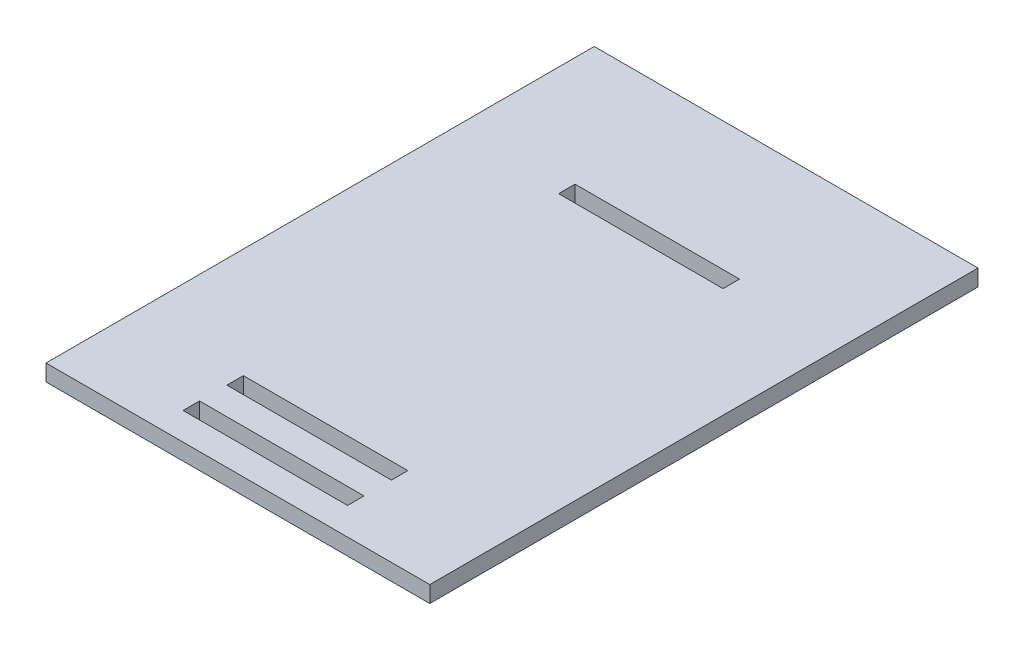
ISO-10303-21;
HEADER;
FILE_DESCRIPTION(('STEP AP214'),'2;1');
FILE_NAME('part.step','',(''),(''),'','','');
FILE_SCHEMA(('AUTOMOTIVE_DESIGN { 1 0 10303 214 1 1 1 1 }'));
ENDSEC;
DATA;
#1=APPLICATION_CONTEXT('core data for automotive mechanical design processes');
#2=APPLICATION_PROTOCOL_DEFINITION('international standard','automotive_design',2000,#1);
#3=PRODUCT_CONTEXT('',#1,'mechanical');
#4=PRODUCT('Part','Part','',(#3));
#5=PRODUCT_RELATED_PRODUCT_CATEGORY('part','',(#4));
#6=PRODUCT_DEFINITION_FORMATION('','',#4);
#7=PRODUCT_DEFINITION_CONTEXT('part definition',#1,'design');
#8=PRODUCT_DEFINITION('design','',#6,#7);
#9=PRODUCT_DEFINITION_SHAPE('','',#8);
#10=(LENGTH_UNIT() NAMED_UNIT(*) SI_UNIT(.MILLI.,.METRE.));
#11=(NAMED_UNIT(*) PLANE_ANGLE_UNIT() SI_UNIT($,.RADIAN.));
#12=(NAMED_UNIT(*) SI_UNIT($,.STERADIAN.) SOLID_ANGLE_UNIT());
#13=UNCERTAINTY_MEASURE_WITH_UNIT(LENGTH_MEASURE(1.E-05),#10,'distance_accuracy_value','');
#14=(GEOMETRIC_REPRESENTATION_CONTEXT(3) GLOBAL_UNCERTAINTY_ASSIGNED_CONTEXT((#13)) GLOBAL_UNIT_ASSIGNED_CONTEXT((#10,
#11,#12)) REPRESENTATION_CONTEXT('',''));
#15=CARTESIAN_POINT('',(0.,0.,0.));
#16=DIRECTION('',(0.,0.,1.));
#17=DIRECTION('',(1.,0.,0.));
#18=AXIS2_PLACEMENT_3D('',#15,#16,#17);
#19=CARTESIAN_POINT('',(-35.,3.,-50.));
#20=DIRECTION('',(1.,0.,0.));
#21=DIRECTION('',(0.,0.,-1.));
#22=AXIS2_PLACEMENT_3D('',#19,#20,#21);
#23=PLANE('',#22);
#24=DIRECTION('',(0.,0.,1.));
#25=VECTOR('',#24,1.);
#26=CARTESIAN_POINT('',(-35.,0.,-50.));
#27=LINE('',#26,#25);
#28=CARTESIAN_POINT('',(-35.,0.,-50.));
#29=VERTEX_POINT('',#28);
#30=CARTESIAN_POINT('',(-35.,0.,50.));
#31=VERTEX_POINT('',#30);
#32=EDGE_CURVE('E188',#29,#31,#27,.T.);
#33=ORIENTED_EDGE('',*,*,#32,.T.);
#34=DIRECTION('',(0.,-1.,0.));
#35=VECTOR('',#34,1.);
#36=CARTESIAN_POINT('',(-35.,3.,50.));
#37=LINE('',#36,#35);
#38=CARTESIAN_POINT('',(-35.,3.,50.));
#39=VERTEX_POINT('',#38);
#40=EDGE_CURVE('E11',#39,#31,#37,.T.);
#41=ORIENTED_EDGE('',*,*,#40,.F.);
#42=DIRECTION('',(0.,0.,1.));
#43=VECTOR('',#42,1.);
#44=CARTESIAN_POINT('',(-35.,3.,-50.));
#45=LINE('',#44,#43);
#46=CARTESIAN_POINT('',(-35.,3.,-50.));
#47=VERTEX_POINT('',#46);
#48=EDGE_CURVE('E254',#47,#39,#45,.T.);
#49=ORIENTED_EDGE('',*,*,#48,.F.);
#50=DIRECTION('',(0.,-1.,0.));
#51=VECTOR('',#50,1.);
#52=CARTESIAN_POINT('',(-35.,3.,-50.));
#53=LINE('',#52,#51);
#54=EDGE_CURVE('E264',#47,#29,#53,.T.);
#55=ORIENTED_EDGE('',*,*,#54,.T.);
#56=EDGE_LOOP('',(#33,#41,#49,#55));
#57=FACE_BOUND('',#56,.T.);
#58=ADVANCED_FACE('F40',(#57),#23,.F.);
#59=CARTESIAN_POINT('',(35.,3.,50.));
#60=DIRECTION('',(0.,0.,-1.));
#61=DIRECTION('',(-1.,0.,0.));
#62=AXIS2_PLACEMENT_3D('',#59,#60,#61);
#63=PLANE('',#62);
#64=DIRECTION('',(1.,0.,0.));
#65=VECTOR('',#64,1.);
#66=CARTESIAN_POINT('',(35.,0.,50.));
#67=LINE('',#66,#65);
#68=CARTESIAN_POINT('',(35.,0.,50.));
#69=VERTEX_POINT('',#68);
#70=EDGE_CURVE('E267',#31,#69,#67,.T.);
#71=ORIENTED_EDGE('',*,*,#70,.T.);
#72=DIRECTION('',(0.,-1.,0.));
#73=VECTOR('',#72,1.);
#74=CARTESIAN_POINT('',(35.,3.,50.));
#75=LINE('',#74,#73);
#76=CARTESIAN_POINT('',(35.,3.,50.));
#77=VERTEX_POINT('',#76);
#78=EDGE_CURVE('E47',#77,#69,#75,.T.);
#79=ORIENTED_EDGE('',*,*,#78,.F.);
#80=DIRECTION('',(1.,0.,0.));
#81=VECTOR('',#80,1.);
#82=CARTESIAN_POINT('',(35.,3.,50.));
#83=LINE('',#82,#81);
#84=EDGE_CURVE('E257',#39,#77,#83,.T.);
#85=ORIENTED_EDGE('',*,*,#84,.F.);
#86=ORIENTED_EDGE('',*,*,#40,.T.);
#87=EDGE_LOOP('',(#71,#79,#85,#86));
#88=FACE_BOUND('',#87,.T.);
#89=ADVANCED_FACE('F296',(#88),#63,.F.);
#90=CARTESIAN_POINT('',(35.,3.,-50.));
#91=DIRECTION('',(-1.,0.,0.));
#92=DIRECTION('',(0.,0.,1.));
#93=AXIS2_PLACEMENT_3D('',#90,#91,#92);
#94=PLANE('',#93);
#95=DIRECTION('',(0.,0.,-1.));
#96=VECTOR('',#95,1.);
#97=CARTESIAN_POINT('',(35.,0.,-50.));
#98=LINE('',#97,#96);
#99=CARTESIAN_POINT('',(35.,0.,-50.));
#100=VERTEX_POINT('',#99);
#101=EDGE_CURVE('E269',#69,#100,#98,.T.);
#102=ORIENTED_EDGE('',*,*,#101,.T.);
#103=DIRECTION('',(0.,-1.,0.));
#104=VECTOR('',#103,1.);
#105=CARTESIAN_POINT('',(35.,3.,-50.));
#106=LINE('',#105,#104);
#107=CARTESIAN_POINT('',(35.,3.,-50.));
#108=VERTEX_POINT('',#107);
#109=EDGE_CURVE('E274',#108,#100,#106,.T.);
#110=ORIENTED_EDGE('',*,*,#109,.F.);
#111=DIRECTION('',(0.,0.,-1.));
#112=VECTOR('',#111,1.);
#113=CARTESIAN_POINT('',(35.,3.,-50.));
#114=LINE('',#113,#112);
#115=EDGE_CURVE('E260',#77,#108,#114,.T.);
#116=ORIENTED_EDGE('',*,*,#115,.F.);
#117=ORIENTED_EDGE('',*,*,#78,.T.);
#118=EDGE_LOOP('',(#102,#110,#116,#117));
#119=FACE_BOUND('',#118,.T.);
#120=ADVANCED_FACE('F281',(#119),#94,.F.);
#121=CARTESIAN_POINT('',(35.,3.,-50.));
#122=DIRECTION('',(0.,0.,1.));
#123=DIRECTION('',(1.,0.,0.));
#124=AXIS2_PLACEMENT_3D('',#121,#122,#123);
#125=PLANE('',#124);
#126=DIRECTION('',(-1.,0.,0.));
#127=VECTOR('',#126,1.);
#128=CARTESIAN_POINT('',(35.,0.,-50.));
#129=LINE('',#128,#127);
#130=EDGE_CURVE('E258',#100,#29,#129,.T.);
#131=ORIENTED_EDGE('',*,*,#130,.T.);
#132=ORIENTED_EDGE('',*,*,#54,.F.);
#133=DIRECTION('',(-1.,0.,0.));
#134=VECTOR('',#133,1.);
#135=CARTESIAN_POINT('',(35.,3.,-50.));
#136=LINE('',#135,#134);
#137=EDGE_CURVE('E262',#108,#47,#136,.T.);
#138=ORIENTED_EDGE('',*,*,#137,.F.);
#139=ORIENTED_EDGE('',*,*,#109,.T.);
#140=EDGE_LOOP('',(#131,#132,#138,#139));
#141=FACE_BOUND('',#140,.T.);
#142=ADVANCED_FACE('F289',(#141),#125,.F.);
#143=CARTESIAN_POINT('',(0.,3.,0.));
#144=DIRECTION('',(0.,-1.,0.));
#145=DIRECTION('',(0.,0.,-1.));
#146=AXIS2_PLACEMENT_3D('',#143,#144,#145);
#147=PLANE('',#146);
#148=DIRECTION('',(1.,0.,0.));
#149=VECTOR('',#148,1.);
#150=CARTESIAN_POINT('',(15.0000000000002,3.,45.));
#151=LINE('',#150,#149);
#152=CARTESIAN_POINT('',(-14.9999999999998,3.,45.));
#153=VERTEX_POINT('',#152);
#154=CARTESIAN_POINT('',(15.0000000000002,3.,45.));
#155=VERTEX_POINT('',#154);
#156=EDGE_CURVE('E182',#153,#155,#151,.T.);
#157=ORIENTED_EDGE('',*,*,#156,.F.);
#158=DIRECTION('',(0.,0.,1.));
#159=VECTOR('',#158,1.);
#160=CARTESIAN_POINT('',(-14.9999999999998,3.,42.));
#161=LINE('',#160,#159);
#162=CARTESIAN_POINT('',(-14.9999999999998,3.,42.));
#163=VERTEX_POINT('',#162);
#164=EDGE_CURVE('E54',#163,#153,#161,.T.);
#165=ORIENTED_EDGE('',*,*,#164,.F.);
#166=DIRECTION('',(-1.,0.,0.));
#167=VECTOR('',#166,1.);
#168=CARTESIAN_POINT('',(15.0000000000002,3.,42.));
#169=LINE('',#168,#167);
#170=CARTESIAN_POINT('',(15.0000000000002,3.,42.));
#171=VERTEX_POINT('',#170);
#172=EDGE_CURVE('E173',#171,#163,#169,.T.);
#173=ORIENTED_EDGE('',*,*,#172,.F.);
#174=DIRECTION('',(0.,0.,-1.));
#175=VECTOR('',#174,1.);
#176=CARTESIAN_POINT('',(15.0000000000002,3.,42.));
#177=LINE('',#176,#175);
#178=EDGE_CURVE('E176',#155,#171,#177,.T.);
#179=ORIENTED_EDGE('',*,*,#178,.F.);
#180=EDGE_LOOP('',(#157,#165,#173,#179));
#181=FACE_BOUND('',#180,.T.);
#182=DIRECTION('',(1.,0.,0.));
#183=VECTOR('',#182,1.);
#184=CARTESIAN_POINT('',(15.0000000000001,3.,37.));
#185=LINE('',#184,#183);
#186=CARTESIAN_POINT('',(-14.9999999999999,3.,37.));
#187=VERTEX_POINT('',#186);
#188=CARTESIAN_POINT('',(15.0000000000001,3.,37.));
#189=VERTEX_POINT('',#188);
#190=EDGE_CURVE('E209',#187,#189,#185,.T.);
#191=ORIENTED_EDGE('',*,*,#190,.F.);
#192=DIRECTION('',(0.,0.,1.));
#193=VECTOR('',#192,1.);
#194=CARTESIAN_POINT('',(-14.9999999999999,3.,34.));
#195=LINE('',#194,#193);
#196=CARTESIAN_POINT('',(-14.9999999999999,3.,34.));
#197=VERTEX_POINT('',#196);
#198=EDGE_CURVE('E62',#197,#187,#195,.T.);
#199=ORIENTED_EDGE('',*,*,#198,.F.);
#200=DIRECTION('',(-1.,0.,0.));
#201=VECTOR('',#200,1.);
#202=CARTESIAN_POINT('',(15.0000000000001,3.,34.));
#203=LINE('',#202,#201);
#204=CARTESIAN_POINT('',(15.0000000000001,3.,34.));
#205=VERTEX_POINT('',#204);
#206=EDGE_CURVE('E202',#205,#197,#203,.T.);
#207=ORIENTED_EDGE('',*,*,#206,.F.);
#208=DIRECTION('',(0.,0.,-1.));
#209=VECTOR('',#208,1.);
#210=CARTESIAN_POINT('',(15.0000000000001,3.,34.));
#211=LINE('',#210,#209);
#212=EDGE_CURVE('E205',#189,#205,#211,.T.);
#213=ORIENTED_EDGE('',*,*,#212,.F.);
#214=EDGE_LOOP('',(#191,#199,#207,#213));
#215=FACE_BOUND('',#214,.T.);
#216=DIRECTION('',(1.,0.,0.));
#217=VECTOR('',#216,1.);
#218=CARTESIAN_POINT('',(15.0000000000001,3.,-23.5));
#219=LINE('',#218,#217);
#220=CARTESIAN_POINT('',(-14.9999999999999,3.,-23.5));
#221=VERTEX_POINT('',#220);
#222=CARTESIAN_POINT('',(15.0000000000001,3.,-23.5));
#223=VERTEX_POINT('',#222);
#224=EDGE_CURVE('E240',#221,#223,#219,.T.);
#225=ORIENTED_EDGE('',*,*,#224,.F.);
#226=DIRECTION('',(0.,0.,1.));
#227=VECTOR('',#226,1.);
#228=CARTESIAN_POINT('',(-14.9999999999999,3.,-23.5));
#229=LINE('',#228,#227);
#230=CARTESIAN_POINT('',(-14.9999999999999,3.,-26.5));
#231=VERTEX_POINT('',#230);
#232=EDGE_CURVE('E201',#231,#221,#229,.T.);
#233=ORIENTED_EDGE('',*,*,#232,.F.);
#234=DIRECTION('',(-1.,0.,0.));
#235=VECTOR('',#234,1.);
#236=CARTESIAN_POINT('',(15.0000000000001,3.,-26.5));
#237=LINE('',#236,#235);
#238=CARTESIAN_POINT('',(15.0000000000001,3.,-26.5));
#239=VERTEX_POINT('',#238);
#240=EDGE_CURVE('E233',#239,#231,#237,.T.);
#241=ORIENTED_EDGE('',*,*,#240,.F.);
#242=DIRECTION('',(0.,0.,-1.));
#243=VECTOR('',#242,1.);
#244=CARTESIAN_POINT('',(15.0000000000001,3.,-23.5));
#245=LINE('',#244,#243);
#246=EDGE_CURVE('E236',#223,#239,#245,.T.);
#247=ORIENTED_EDGE('',*,*,#246,.F.);
#248=EDGE_LOOP('',(#225,#233,#241,#247));
#249=FACE_BOUND('',#248,.T.);
#250=ORIENTED_EDGE('',*,*,#48,.T.);
#251=ORIENTED_EDGE('',*,*,#84,.T.);
#252=ORIENTED_EDGE('',*,*,#115,.T.);
#253=ORIENTED_EDGE('',*,*,#137,.T.);
#254=EDGE_LOOP('',(#250,#251,#252,#253));
#255=FACE_BOUND('',#254,.T.);
#256=ADVANCED_FACE('F295',(#181,#215,#249,#255),#147,.F.);
#257=CARTESIAN_POINT('',(0.,0.,0.));
#258=DIRECTION('',(0.,-1.,0.));
#259=DIRECTION('',(0.,0.,-1.));
#260=AXIS2_PLACEMENT_3D('',#257,#258,#259);
#261=PLANE('',#260);
#262=DIRECTION('',(0.,0.,1.));
#263=VECTOR('',#262,1.);
#264=CARTESIAN_POINT('',(-14.9999999999998,0.,42.));
#265=LINE('',#264,#263);
#266=CARTESIAN_POINT('',(-14.9999999999998,0.,42.));
#267=VERTEX_POINT('',#266);
#268=CARTESIAN_POINT('',(-14.9999999999998,0.,45.));
#269=VERTEX_POINT('',#268);
#270=EDGE_CURVE('E154',#267,#269,#265,.T.);
#271=ORIENTED_EDGE('',*,*,#270,.T.);
#272=DIRECTION('',(1.,0.,0.));
#273=VECTOR('',#272,1.);
#274=CARTESIAN_POINT('',(15.0000000000002,0.,45.));
#275=LINE('',#274,#273);
#276=CARTESIAN_POINT('',(15.0000000000002,0.,45.));
#277=VERTEX_POINT('',#276);
#278=EDGE_CURVE('E164',#269,#277,#275,.T.);
#279=ORIENTED_EDGE('',*,*,#278,.T.);
#280=DIRECTION('',(0.,0.,-1.));
#281=VECTOR('',#280,1.);
#282=CARTESIAN_POINT('',(15.0000000000002,0.,42.));
#283=LINE('',#282,#281);
#284=CARTESIAN_POINT('',(15.0000000000002,0.,42.));
#285=VERTEX_POINT('',#284);
#286=EDGE_CURVE('E168',#277,#285,#283,.T.);
#287=ORIENTED_EDGE('',*,*,#286,.T.);
#288=DIRECTION('',(-1.,0.,0.));
#289=VECTOR('',#288,1.);
#290=CARTESIAN_POINT('',(15.0000000000002,0.,42.));
#291=LINE('',#290,#289);
#292=EDGE_CURVE('E160',#285,#267,#291,.T.);
#293=ORIENTED_EDGE('',*,*,#292,.T.);
#294=EDGE_LOOP('',(#271,#279,#287,#293));
#295=FACE_BOUND('',#294,.T.);
#296=DIRECTION('',(0.,0.,1.));
#297=VECTOR('',#296,1.);
#298=CARTESIAN_POINT('',(-14.9999999999999,0.,34.));
#299=LINE('',#298,#297);
#300=CARTESIAN_POINT('',(-14.9999999999999,0.,34.));
#301=VERTEX_POINT('',#300);
#302=CARTESIAN_POINT('',(-14.9999999999999,0.,37.));
#303=VERTEX_POINT('',#302);
#304=EDGE_CURVE('E206',#301,#303,#299,.T.);
#305=ORIENTED_EDGE('',*,*,#304,.T.);
#306=DIRECTION('',(1.,0.,0.));
#307=VECTOR('',#306,1.);
#308=CARTESIAN_POINT('',(15.0000000000001,0.,37.));
#309=LINE('',#308,#307);
#310=CARTESIAN_POINT('',(15.0000000000001,0.,37.));
#311=VERTEX_POINT('',#310);
#312=EDGE_CURVE('E218',#303,#311,#309,.T.);
#313=ORIENTED_EDGE('',*,*,#312,.T.);
#314=DIRECTION('',(0.,0.,-1.));
#315=VECTOR('',#314,1.);
#316=CARTESIAN_POINT('',(15.0000000000001,0.,34.));
#317=LINE('',#316,#315);
#318=CARTESIAN_POINT('',(15.0000000000001,0.,34.));
#319=VERTEX_POINT('',#318);
#320=EDGE_CURVE('E215',#311,#319,#317,.T.);
#321=ORIENTED_EDGE('',*,*,#320,.T.);
#322=DIRECTION('',(-1.,0.,0.));
#323=VECTOR('',#322,1.);
#324=CARTESIAN_POINT('',(15.0000000000001,0.,34.));
#325=LINE('',#324,#323);
#326=EDGE_CURVE('E194',#319,#301,#325,.T.);
#327=ORIENTED_EDGE('',*,*,#326,.T.);
#328=EDGE_LOOP('',(#305,#313,#321,#327));
#329=FACE_BOUND('',#328,.T.);
#330=DIRECTION('',(0.,0.,1.));
#331=VECTOR('',#330,1.);
#332=CARTESIAN_POINT('',(-14.9999999999999,0.,-23.5));
#333=LINE('',#332,#331);
#334=CARTESIAN_POINT('',(-14.9999999999999,0.,-26.5));
#335=VERTEX_POINT('',#334);
#336=CARTESIAN_POINT('',(-14.9999999999999,0.,-23.5));
#337=VERTEX_POINT('',#336);
#338=EDGE_CURVE('E237',#335,#337,#333,.T.);
#339=ORIENTED_EDGE('',*,*,#338,.T.);
#340=DIRECTION('',(1.,0.,0.));
#341=VECTOR('',#340,1.);
#342=CARTESIAN_POINT('',(15.0000000000001,0.,-23.5));
#343=LINE('',#342,#341);
#344=CARTESIAN_POINT('',(15.0000000000001,0.,-23.5));
#345=VERTEX_POINT('',#344);
#346=EDGE_CURVE('E249',#337,#345,#343,.T.);
#347=ORIENTED_EDGE('',*,*,#346,.T.);
#348=DIRECTION('',(0.,0.,-1.));
#349=VECTOR('',#348,1.);
#350=CARTESIAN_POINT('',(15.0000000000001,0.,-23.5));
#351=LINE('',#350,#349);
#352=CARTESIAN_POINT('',(15.0000000000001,0.,-26.5));
#353=VERTEX_POINT('',#352);
#354=EDGE_CURVE('E246',#345,#353,#351,.T.);
#355=ORIENTED_EDGE('',*,*,#354,.T.);
#356=DIRECTION('',(-1.,0.,0.));
#357=VECTOR('',#356,1.);
#358=CARTESIAN_POINT('',(15.0000000000001,0.,-26.5));
#359=LINE('',#358,#357);
#360=EDGE_CURVE('E226',#353,#335,#359,.T.);
#361=ORIENTED_EDGE('',*,*,#360,.T.);
#362=EDGE_LOOP('',(#339,#347,#355,#361));
#363=FACE_BOUND('',#362,.T.);
#364=ORIENTED_EDGE('',*,*,#32,.F.);
#365=ORIENTED_EDGE('',*,*,#130,.F.);
#366=ORIENTED_EDGE('',*,*,#101,.F.);
#367=ORIENTED_EDGE('',*,*,#70,.F.);
#368=EDGE_LOOP('',(#364,#365,#366,#367));
#369=FACE_BOUND('',#368,.T.);
#370=ADVANCED_FACE('F170',(#295,#329,#363,#369),#261,.T.);
#371=CARTESIAN_POINT('',(-14.9999999999999,0.,-23.5));
#372=DIRECTION('',(-1.,0.,0.));
#373=DIRECTION('',(0.,0.,1.));
#374=AXIS2_PLACEMENT_3D('',#371,#372,#373);
#375=PLANE('',#374);
#376=ORIENTED_EDGE('',*,*,#232,.T.);
#377=DIRECTION('',(0.,1.,0.));
#378=VECTOR('',#377,1.);
#379=CARTESIAN_POINT('',(-14.9999999999999,0.,-23.5));
#380=LINE('',#379,#378);
#381=EDGE_CURVE('E223',#337,#221,#380,.T.);
#382=ORIENTED_EDGE('',*,*,#381,.F.);
#383=ORIENTED_EDGE('',*,*,#338,.F.);
#384=DIRECTION('',(0.,1.,0.));
#385=VECTOR('',#384,1.);
#386=CARTESIAN_POINT('',(-14.9999999999999,0.,-26.5));
#387=LINE('',#386,#385);
#388=EDGE_CURVE('E231',#335,#231,#387,.T.);
#389=ORIENTED_EDGE('',*,*,#388,.T.);
#390=EDGE_LOOP('',(#376,#382,#383,#389));
#391=FACE_BOUND('',#390,.T.);
#392=ADVANCED_FACE('F308',(#391),#375,.F.);
#393=CARTESIAN_POINT('',(15.0000000000001,0.,-26.5));
#394=DIRECTION('',(0.,0.,-1.));
#395=DIRECTION('',(-1.,0.,0.));
#396=AXIS2_PLACEMENT_3D('',#393,#394,#395);
#397=PLANE('',#396);
#398=ORIENTED_EDGE('',*,*,#240,.T.);
#399=ORIENTED_EDGE('',*,*,#388,.F.);
#400=ORIENTED_EDGE('',*,*,#360,.F.);
#401=DIRECTION('',(0.,1.,0.));
#402=VECTOR('',#401,1.);
#403=CARTESIAN_POINT('',(15.0000000000001,0.,-26.5));
#404=LINE('',#403,#402);
#405=EDGE_CURVE('E229',#353,#239,#404,.T.);
#406=ORIENTED_EDGE('',*,*,#405,.T.);
#407=EDGE_LOOP('',(#398,#399,#400,#406));
#408=FACE_BOUND('',#407,.T.);
#409=ADVANCED_FACE('F312',(#408),#397,.F.);
#410=CARTESIAN_POINT('',(15.0000000000001,0.,-23.5));
#411=DIRECTION('',(1.,0.,0.));
#412=DIRECTION('',(0.,0.,-1.));
#413=AXIS2_PLACEMENT_3D('',#410,#411,#412);
#414=PLANE('',#413);
#415=ORIENTED_EDGE('',*,*,#246,.T.);
#416=ORIENTED_EDGE('',*,*,#405,.F.);
#417=ORIENTED_EDGE('',*,*,#354,.F.);
#418=DIRECTION('',(0.,1.,0.));
#419=VECTOR('',#418,1.);
#420=CARTESIAN_POINT('',(15.0000000000001,0.,-23.5));
#421=LINE('',#420,#419);
#422=EDGE_CURVE('E227',#345,#223,#421,.T.);
#423=ORIENTED_EDGE('',*,*,#422,.T.);
#424=EDGE_LOOP('',(#415,#416,#417,#423));
#425=FACE_BOUND('',#424,.T.);
#426=ADVANCED_FACE('F315',(#425),#414,.F.);
#427=CARTESIAN_POINT('',(15.0000000000001,0.,-23.5));
#428=DIRECTION('',(0.,0.,1.));
#429=DIRECTION('',(1.,0.,0.));
#430=AXIS2_PLACEMENT_3D('',#427,#428,#429);
#431=PLANE('',#430);
#432=ORIENTED_EDGE('',*,*,#224,.T.);
#433=ORIENTED_EDGE('',*,*,#422,.F.);
#434=ORIENTED_EDGE('',*,*,#346,.F.);
#435=ORIENTED_EDGE('',*,*,#381,.T.);
#436=EDGE_LOOP('',(#432,#433,#434,#435));
#437=FACE_BOUND('',#436,.T.);
#438=ADVANCED_FACE('F319',(#437),#431,.F.);
#439=CARTESIAN_POINT('',(-14.9999999999999,0.,34.));
#440=DIRECTION('',(-1.,0.,0.));
#441=DIRECTION('',(0.,0.,1.));
#442=AXIS2_PLACEMENT_3D('',#439,#440,#441);
#443=PLANE('',#442);
#444=ORIENTED_EDGE('',*,*,#198,.T.);
#445=DIRECTION('',(0.,1.,0.));
#446=VECTOR('',#445,1.);
#447=CARTESIAN_POINT('',(-14.9999999999999,0.,37.));
#448=LINE('',#447,#446);
#449=EDGE_CURVE('E192',#303,#187,#448,.T.);
#450=ORIENTED_EDGE('',*,*,#449,.F.);
#451=ORIENTED_EDGE('',*,*,#304,.F.);
#452=DIRECTION('',(0.,1.,0.));
#453=VECTOR('',#452,1.);
#454=CARTESIAN_POINT('',(-14.9999999999999,0.,34.));
#455=LINE('',#454,#453);
#456=EDGE_CURVE('E199',#301,#197,#455,.T.);
#457=ORIENTED_EDGE('',*,*,#456,.T.);
#458=EDGE_LOOP('',(#444,#450,#451,#457));
#459=FACE_BOUND('',#458,.T.);
#460=ADVANCED_FACE('F323',(#459),#443,.F.);
#461=CARTESIAN_POINT('',(15.0000000000001,0.,34.));
#462=DIRECTION('',(0.,0.,-1.));
#463=DIRECTION('',(-1.,0.,0.));
#464=AXIS2_PLACEMENT_3D('',#461,#462,#463);
#465=PLANE('',#464);
#466=ORIENTED_EDGE('',*,*,#206,.T.);
#467=ORIENTED_EDGE('',*,*,#456,.F.);
#468=ORIENTED_EDGE('',*,*,#326,.F.);
#469=DIRECTION('',(0.,1.,0.));
#470=VECTOR('',#469,1.);
#471=CARTESIAN_POINT('',(15.0000000000001,0.,34.));
#472=LINE('',#471,#470);
#473=EDGE_CURVE('E197',#319,#205,#472,.T.);
#474=ORIENTED_EDGE('',*,*,#473,.T.);
#475=EDGE_LOOP('',(#466,#467,#468,#474));
#476=FACE_BOUND('',#475,.T.);
#477=ADVANCED_FACE('F328',(#476),#465,.F.);
#478=CARTESIAN_POINT('',(15.0000000000001,0.,34.));
#479=DIRECTION('',(1.,0.,0.));
#480=DIRECTION('',(0.,0.,-1.));
#481=AXIS2_PLACEMENT_3D('',#478,#479,#480);
#482=PLANE('',#481);
#483=ORIENTED_EDGE('',*,*,#212,.T.);
#484=ORIENTED_EDGE('',*,*,#473,.F.);
#485=ORIENTED_EDGE('',*,*,#320,.F.);
#486=DIRECTION('',(0.,1.,0.));
#487=VECTOR('',#486,1.);
#488=CARTESIAN_POINT('',(15.0000000000001,0.,37.));
#489=LINE('',#488,#487);
#490=EDGE_CURVE('E195',#311,#189,#489,.T.);
#491=ORIENTED_EDGE('',*,*,#490,.T.);
#492=EDGE_LOOP('',(#483,#484,#485,#491));
#493=FACE_BOUND('',#492,.T.);
#494=ADVANCED_FACE('F331',(#493),#482,.F.);
#495=CARTESIAN_POINT('',(15.0000000000001,0.,37.));
#496=DIRECTION('',(0.,0.,1.));
#497=DIRECTION('',(1.,0.,0.));
#498=AXIS2_PLACEMENT_3D('',#495,#496,#497);
#499=PLANE('',#498);
#500=ORIENTED_EDGE('',*,*,#190,.T.);
#501=ORIENTED_EDGE('',*,*,#490,.F.);
#502=ORIENTED_EDGE('',*,*,#312,.F.);
#503=ORIENTED_EDGE('',*,*,#449,.T.);
#504=EDGE_LOOP('',(#500,#501,#502,#503));
#505=FACE_BOUND('',#504,.T.);
#506=ADVANCED_FACE('F335',(#505),#499,.F.);
#507=CARTESIAN_POINT('',(-14.9999999999998,0.,42.));
#508=DIRECTION('',(-1.,0.,0.));
#509=DIRECTION('',(0.,0.,1.));
#510=AXIS2_PLACEMENT_3D('',#507,#508,#509);
#511=PLANE('',#510);
#512=ORIENTED_EDGE('',*,*,#164,.T.);
#513=DIRECTION('',(0.,1.,0.));
#514=VECTOR('',#513,1.);
#515=CARTESIAN_POINT('',(-14.9999999999998,0.,45.));
#516=LINE('',#515,#514);
#517=EDGE_CURVE('E150',#269,#153,#516,.T.);
#518=ORIENTED_EDGE('',*,*,#517,.F.);
#519=ORIENTED_EDGE('',*,*,#270,.F.);
#520=DIRECTION('',(0.,1.,0.));
#521=VECTOR('',#520,1.);
#522=CARTESIAN_POINT('',(-14.9999999999998,0.,42.));
#523=LINE('',#522,#521);
#524=EDGE_CURVE('E186',#267,#163,#523,.T.);
#525=ORIENTED_EDGE('',*,*,#524,.T.);
#526=EDGE_LOOP('',(#512,#518,#519,#525));
#527=FACE_BOUND('',#526,.T.);
#528=ADVANCED_FACE('F152',(#527),#511,.F.);
#529=CARTESIAN_POINT('',(15.0000000000002,0.,42.));
#530=DIRECTION('',(0.,0.,-1.));
#531=DIRECTION('',(-1.,0.,0.));
#532=AXIS2_PLACEMENT_3D('',#529,#530,#531);
#533=PLANE('',#532);
#534=ORIENTED_EDGE('',*,*,#172,.T.);
#535=ORIENTED_EDGE('',*,*,#524,.F.);
#536=ORIENTED_EDGE('',*,*,#292,.F.);
#537=DIRECTION('',(0.,1.,0.));
#538=VECTOR('',#537,1.);
#539=CARTESIAN_POINT('',(15.0000000000002,0.,42.));
#540=LINE('',#539,#538);
#541=EDGE_CURVE('E189',#285,#171,#540,.T.);
#542=ORIENTED_EDGE('',*,*,#541,.T.);
#543=EDGE_LOOP('',(#534,#535,#536,#542));
#544=FACE_BOUND('',#543,.T.);
#545=ADVANCED_FACE('F344',(#544),#533,.F.);
#546=CARTESIAN_POINT('',(15.0000000000002,0.,42.));
#547=DIRECTION('',(1.,0.,0.));
#548=DIRECTION('',(0.,0.,-1.));
#549=AXIS2_PLACEMENT_3D('',#546,#547,#548);
#550=PLANE('',#549);
#551=ORIENTED_EDGE('',*,*,#178,.T.);
#552=ORIENTED_EDGE('',*,*,#541,.F.);
#553=ORIENTED_EDGE('',*,*,#286,.F.);
#554=DIRECTION('',(0.,1.,0.));
#555=VECTOR('',#554,1.);
#556=CARTESIAN_POINT('',(15.0000000000002,0.,45.));
#557=LINE('',#556,#555);
#558=EDGE_CURVE('E159',#277,#155,#557,.T.);
#559=ORIENTED_EDGE('',*,*,#558,.T.);
#560=EDGE_LOOP('',(#551,#552,#553,#559));
#561=FACE_BOUND('',#560,.T.);
#562=ADVANCED_FACE('F347',(#561),#550,.F.);
#563=CARTESIAN_POINT('',(15.0000000000002,0.,45.));
#564=DIRECTION('',(0.,0.,1.));
#565=DIRECTION('',(1.,0.,0.));
#566=AXIS2_PLACEMENT_3D('',#563,#564,#565);
#567=PLANE('',#566);
#568=ORIENTED_EDGE('',*,*,#156,.T.);
#569=ORIENTED_EDGE('',*,*,#558,.F.);
#570=ORIENTED_EDGE('',*,*,#278,.F.);
#571=ORIENTED_EDGE('',*,*,#517,.T.);
#572=EDGE_LOOP('',(#568,#569,#570,#571));
#573=FACE_BOUND('',#572,.T.);
#574=ADVANCED_FACE('F165',(#573),#567,.F.);
#575=CLOSED_SHELL('',(#58,#89,#120,#142,#256,#370,#392,#409,#426,#438,#460,#477,#494,#506,#528,
#545,#562,#574));
#576=MANIFOLD_SOLID_BREP('B2',#575);
#577=ADVANCED_BREP_SHAPE_REPRESENTATION('',(#18,#576),#14);
#578=SHAPE_DEFINITION_REPRESENTATION(#9,#577);
ENDSEC;
END-ISO-10303-21;
